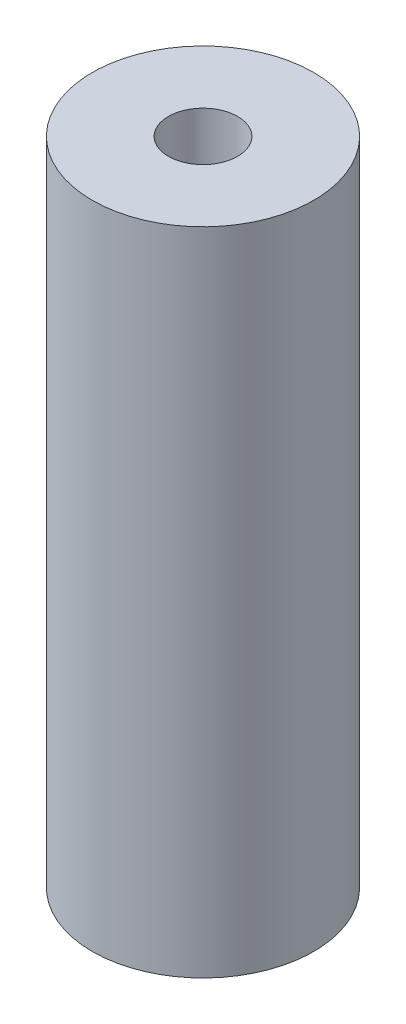
ISO-10303-21;
HEADER;
FILE_DESCRIPTION(('STEP AP214'),'2;1');
FILE_NAME('part.step','',(''),(''),'','','');
FILE_SCHEMA(('AUTOMOTIVE_DESIGN { 1 0 10303 214 1 1 1 1 }'));
ENDSEC;
DATA;
#1=APPLICATION_CONTEXT('core data for automotive mechanical design processes');
#2=APPLICATION_PROTOCOL_DEFINITION('international standard','automotive_design',2000,#1);
#3=PRODUCT_CONTEXT('',#1,'mechanical');
#4=PRODUCT('Part','Part','',(#3));
#5=PRODUCT_RELATED_PRODUCT_CATEGORY('part','',(#4));
#6=PRODUCT_DEFINITION_FORMATION('','',#4);
#7=PRODUCT_DEFINITION_CONTEXT('part definition',#1,'design');
#8=PRODUCT_DEFINITION('design','',#6,#7);
#9=PRODUCT_DEFINITION_SHAPE('','',#8);
#10=(LENGTH_UNIT() NAMED_UNIT(*) SI_UNIT(.MILLI.,.METRE.));
#11=(NAMED_UNIT(*) PLANE_ANGLE_UNIT() SI_UNIT($,.RADIAN.));
#12=(NAMED_UNIT(*) SI_UNIT($,.STERADIAN.) SOLID_ANGLE_UNIT());
#13=UNCERTAINTY_MEASURE_WITH_UNIT(LENGTH_MEASURE(1.E-05),#10,'distance_accuracy_value','');
#14=(GEOMETRIC_REPRESENTATION_CONTEXT(3) GLOBAL_UNCERTAINTY_ASSIGNED_CONTEXT((#13)) GLOBAL_UNIT_ASSIGNED_CONTEXT((#10,
#11,#12)) REPRESENTATION_CONTEXT('',''));
#15=CARTESIAN_POINT('',(0.,0.,0.));
#16=DIRECTION('',(0.,0.,1.));
#17=DIRECTION('',(1.,0.,0.));
#18=AXIS2_PLACEMENT_3D('',#15,#16,#17);
#19=CARTESIAN_POINT('',(0.,23.5,0.));
#20=DIRECTION('',(0.,-1.,0.));
#21=DIRECTION('',(0.,0.,-1.));
#22=AXIS2_PLACEMENT_3D('',#19,#20,#21);
#23=CYLINDRICAL_SURFACE('',#22,4.);
#24=CARTESIAN_POINT('',(0.,23.5,0.));
#25=DIRECTION('',(0.,1.,0.));
#26=DIRECTION('',(0.,0.,1.));
#27=AXIS2_PLACEMENT_3D('',#24,#25,#26);
#28=CIRCLE('',#27,4.);
#29=CARTESIAN_POINT('',(0.,23.5,4.));
#30=VERTEX_POINT('',#29);
#31=EDGE_CURVE('E10',#30,#30,#28,.T.);
#32=ORIENTED_EDGE('',*,*,#31,.F.);
#33=EDGE_LOOP('',(#32));
#34=FACE_BOUND('',#33,.T.);
#35=CARTESIAN_POINT('',(0.,0.,0.));
#36=DIRECTION('',(0.,1.,0.));
#37=DIRECTION('',(0.,0.,1.));
#38=AXIS2_PLACEMENT_3D('',#35,#36,#37);
#39=CIRCLE('',#38,4.);
#40=CARTESIAN_POINT('',(0.,0.,4.));
#41=VERTEX_POINT('',#40);
#42=EDGE_CURVE('E42',#41,#41,#39,.T.);
#43=ORIENTED_EDGE('',*,*,#42,.T.);
#44=EDGE_LOOP('',(#43));
#45=FACE_BOUND('',#44,.T.);
#46=ADVANCED_FACE('F39',(#34,#45),#23,.T.);
#47=CARTESIAN_POINT('',(0.,23.5,0.));
#48=DIRECTION('',(0.,1.,0.));
#49=DIRECTION('',(0.,0.,1.));
#50=AXIS2_PLACEMENT_3D('',#47,#48,#49);
#51=PLANE('',#50);
#52=CARTESIAN_POINT('',(0.,23.5,0.));
#53=DIRECTION('',(0.,-1.,0.));
#54=DIRECTION('',(0.,0.,-1.));
#55=AXIS2_PLACEMENT_3D('',#52,#53,#54);
#56=CIRCLE('',#55,1.24999999999999);
#57=CARTESIAN_POINT('',(0.,23.5,-1.24999999999999));
#58=VERTEX_POINT('',#57);
#59=EDGE_CURVE('E49',#58,#58,#56,.T.);
#60=ORIENTED_EDGE('',*,*,#59,.T.);
#61=EDGE_LOOP('',(#60));
#62=FACE_BOUND('',#61,.T.);
#63=ORIENTED_EDGE('',*,*,#31,.T.);
#64=EDGE_LOOP('',(#63));
#65=FACE_BOUND('',#64,.T.);
#66=ADVANCED_FACE('F62',(#62,#65),#51,.T.);
#67=CARTESIAN_POINT('',(0.,0.,0.));
#68=DIRECTION('',(0.,1.,0.));
#69=DIRECTION('',(0.,0.,1.));
#70=AXIS2_PLACEMENT_3D('',#67,#68,#69);
#71=PLANE('',#70);
#72=CARTESIAN_POINT('',(0.,0.,0.));
#73=DIRECTION('',(0.,-1.,0.));
#74=DIRECTION('',(0.,0.,-1.));
#75=AXIS2_PLACEMENT_3D('',#72,#73,#74);
#76=CIRCLE('',#75,1.24999999999999);
#77=CARTESIAN_POINT('',(0.,0.,-1.24999999999999));
#78=VERTEX_POINT('',#77);
#79=EDGE_CURVE('E53',#78,#78,#76,.T.);
#80=ORIENTED_EDGE('',*,*,#79,.F.);
#81=EDGE_LOOP('',(#80));
#82=FACE_BOUND('',#81,.T.);
#83=ORIENTED_EDGE('',*,*,#42,.F.);
#84=EDGE_LOOP('',(#83));
#85=FACE_BOUND('',#84,.T.);
#86=ADVANCED_FACE('F59',(#82,#85),#71,.F.);
#87=CARTESIAN_POINT('',(0.,0.,0.));
#88=DIRECTION('',(0.,-1.,0.));
#89=DIRECTION('',(0.,0.,-1.));
#90=AXIS2_PLACEMENT_3D('',#87,#88,#89);
#91=CYLINDRICAL_SURFACE('',#90,1.24999999999999);
#92=ORIENTED_EDGE('',*,*,#59,.F.);
#93=EDGE_LOOP('',(#92));
#94=FACE_BOUND('',#93,.T.);
#95=ORIENTED_EDGE('',*,*,#79,.T.);
#96=EDGE_LOOP('',(#95));
#97=FACE_BOUND('',#96,.T.);
#98=ADVANCED_FACE('F57',(#94,#97),#91,.F.);
#99=CLOSED_SHELL('',(#46,#66,#86,#98));
#100=MANIFOLD_SOLID_BREP('B2',#99);
#101=ADVANCED_BREP_SHAPE_REPRESENTATION('',(#18,#100),#14);
#102=SHAPE_DEFINITION_REPRESENTATION(#9,#101);
ENDSEC;
END-ISO-10303-21;
